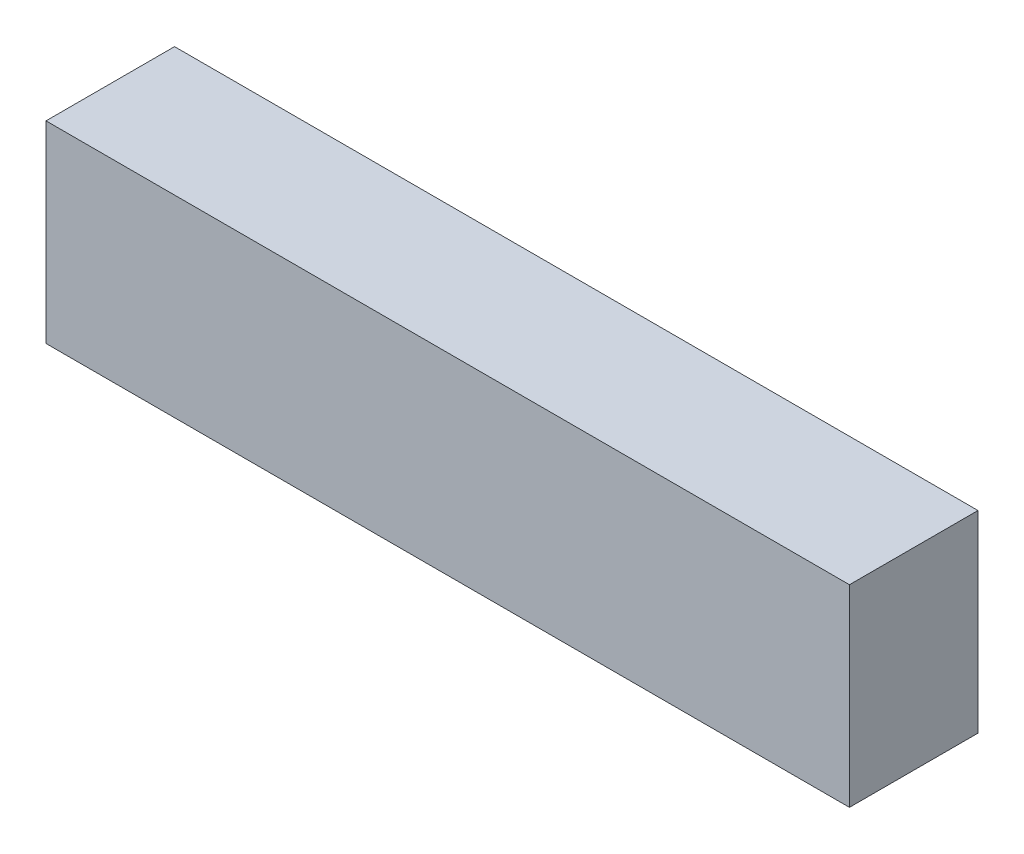
ISO-10303-21;
HEADER;
FILE_DESCRIPTION(('STEP AP214'),'2;1');
FILE_NAME('part.step','',(''),(''),'','','');
FILE_SCHEMA(('AUTOMOTIVE_DESIGN { 1 0 10303 214 1 1 1 1 }'));
ENDSEC;
DATA;
#1=APPLICATION_CONTEXT('core data for automotive mechanical design processes');
#2=APPLICATION_PROTOCOL_DEFINITION('international standard','automotive_design',2000,#1);
#3=PRODUCT_CONTEXT('',#1,'mechanical');
#4=PRODUCT('Part','Part','',(#3));
#5=PRODUCT_RELATED_PRODUCT_CATEGORY('part','',(#4));
#6=PRODUCT_DEFINITION_FORMATION('','',#4);
#7=PRODUCT_DEFINITION_CONTEXT('part definition',#1,'design');
#8=PRODUCT_DEFINITION('design','',#6,#7);
#9=PRODUCT_DEFINITION_SHAPE('','',#8);
#10=(LENGTH_UNIT() NAMED_UNIT(*) SI_UNIT(.MILLI.,.METRE.));
#11=(NAMED_UNIT(*) PLANE_ANGLE_UNIT() SI_UNIT($,.RADIAN.));
#12=(NAMED_UNIT(*) SI_UNIT($,.STERADIAN.) SOLID_ANGLE_UNIT());
#13=UNCERTAINTY_MEASURE_WITH_UNIT(LENGTH_MEASURE(1.E-05),#10,'distance_accuracy_value','');
#14=(GEOMETRIC_REPRESENTATION_CONTEXT(3) GLOBAL_UNCERTAINTY_ASSIGNED_CONTEXT((#13)) GLOBAL_UNIT_ASSIGNED_CONTEXT((#10,
#11,#12)) REPRESENTATION_CONTEXT('',''));
#15=CARTESIAN_POINT('',(0.,0.,0.));
#16=DIRECTION('',(0.,0.,1.));
#17=DIRECTION('',(1.,0.,0.));
#18=AXIS2_PLACEMENT_3D('',#15,#16,#17);
#19=CARTESIAN_POINT('',(25.,-6.,8.));
#20=DIRECTION('',(-1.,0.,0.));
#21=DIRECTION('',(0.,0.,1.));
#22=AXIS2_PLACEMENT_3D('',#19,#20,#21);
#23=PLANE('',#22);
#24=DIRECTION('',(0.,1.,0.));
#25=VECTOR('',#24,1.);
#26=CARTESIAN_POINT('',(25.,-6.,0.));
#27=LINE('',#26,#25);
#28=CARTESIAN_POINT('',(25.,-6.,0.));
#29=VERTEX_POINT('',#28);
#30=CARTESIAN_POINT('',(25.,6.,0.));
#31=VERTEX_POINT('',#30);
#32=EDGE_CURVE('E102',#29,#31,#27,.T.);
#33=ORIENTED_EDGE('',*,*,#32,.T.);
#34=DIRECTION('',(0.,0.,-1.));
#35=VECTOR('',#34,1.);
#36=CARTESIAN_POINT('',(25.,6.,8.));
#37=LINE('',#36,#35);
#38=CARTESIAN_POINT('',(25.,6.,8.));
#39=VERTEX_POINT('',#38);
#40=EDGE_CURVE('E11',#39,#31,#37,.T.);
#41=ORIENTED_EDGE('',*,*,#40,.F.);
#42=DIRECTION('',(0.,1.,0.));
#43=VECTOR('',#42,1.);
#44=CARTESIAN_POINT('',(25.,-6.,8.));
#45=LINE('',#44,#43);
#46=CARTESIAN_POINT('',(25.,-6.,8.));
#47=VERTEX_POINT('',#46);
#48=EDGE_CURVE('E95',#47,#39,#45,.T.);
#49=ORIENTED_EDGE('',*,*,#48,.F.);
#50=DIRECTION('',(0.,0.,-1.));
#51=VECTOR('',#50,1.);
#52=CARTESIAN_POINT('',(25.,-6.,8.));
#53=LINE('',#52,#51);
#54=EDGE_CURVE('E99',#47,#29,#53,.T.);
#55=ORIENTED_EDGE('',*,*,#54,.T.);
#56=EDGE_LOOP('',(#33,#41,#49,#55));
#57=FACE_BOUND('',#56,.T.);
#58=ADVANCED_FACE('F41',(#57),#23,.F.);
#59=CARTESIAN_POINT('',(-25.,6.,8.));
#60=DIRECTION('',(0.,-1.,0.));
#61=DIRECTION('',(0.,0.,-1.));
#62=AXIS2_PLACEMENT_3D('',#59,#60,#61);
#63=PLANE('',#62);
#64=DIRECTION('',(-1.,0.,0.));
#65=VECTOR('',#64,1.);
#66=CARTESIAN_POINT('',(-25.,6.,0.));
#67=LINE('',#66,#65);
#68=CARTESIAN_POINT('',(-25.,6.,0.));
#69=VERTEX_POINT('',#68);
#70=EDGE_CURVE('E96',#31,#69,#67,.T.);
#71=ORIENTED_EDGE('',*,*,#70,.T.);
#72=DIRECTION('',(0.,0.,-1.));
#73=VECTOR('',#72,1.);
#74=CARTESIAN_POINT('',(-25.,6.,8.));
#75=LINE('',#74,#73);
#76=CARTESIAN_POINT('',(-25.,6.,8.));
#77=VERTEX_POINT('',#76);
#78=EDGE_CURVE('E47',#77,#69,#75,.T.);
#79=ORIENTED_EDGE('',*,*,#78,.F.);
#80=DIRECTION('',(-1.,0.,0.));
#81=VECTOR('',#80,1.);
#82=CARTESIAN_POINT('',(-25.,6.,8.));
#83=LINE('',#82,#81);
#84=EDGE_CURVE('E87',#39,#77,#83,.T.);
#85=ORIENTED_EDGE('',*,*,#84,.F.);
#86=ORIENTED_EDGE('',*,*,#40,.T.);
#87=EDGE_LOOP('',(#71,#79,#85,#86));
#88=FACE_BOUND('',#87,.T.);
#89=ADVANCED_FACE('F92',(#88),#63,.F.);
#90=CARTESIAN_POINT('',(-25.,-6.,8.));
#91=DIRECTION('',(1.,0.,0.));
#92=DIRECTION('',(0.,0.,-1.));
#93=AXIS2_PLACEMENT_3D('',#90,#91,#92);
#94=PLANE('',#93);
#95=DIRECTION('',(0.,-1.,0.));
#96=VECTOR('',#95,1.);
#97=CARTESIAN_POINT('',(-25.,-6.,0.));
#98=LINE('',#97,#96);
#99=CARTESIAN_POINT('',(-25.,-6.,0.));
#100=VERTEX_POINT('',#99);
#101=EDGE_CURVE('E74',#69,#100,#98,.T.);
#102=ORIENTED_EDGE('',*,*,#101,.T.);
#103=DIRECTION('',(0.,0.,-1.));
#104=VECTOR('',#103,1.);
#105=CARTESIAN_POINT('',(-25.,-6.,8.));
#106=LINE('',#105,#104);
#107=CARTESIAN_POINT('',(-25.,-6.,8.));
#108=VERTEX_POINT('',#107);
#109=EDGE_CURVE('E100',#108,#100,#106,.T.);
#110=ORIENTED_EDGE('',*,*,#109,.F.);
#111=DIRECTION('',(0.,-1.,0.));
#112=VECTOR('',#111,1.);
#113=CARTESIAN_POINT('',(-25.,-6.,8.));
#114=LINE('',#113,#112);
#115=EDGE_CURVE('E89',#77,#108,#114,.T.);
#116=ORIENTED_EDGE('',*,*,#115,.F.);
#117=ORIENTED_EDGE('',*,*,#78,.T.);
#118=EDGE_LOOP('',(#102,#110,#116,#117));
#119=FACE_BOUND('',#118,.T.);
#120=ADVANCED_FACE('F98',(#119),#94,.F.);
#121=CARTESIAN_POINT('',(-25.,-6.,8.));
#122=DIRECTION('',(0.,1.,0.));
#123=DIRECTION('',(0.,0.,1.));
#124=AXIS2_PLACEMENT_3D('',#121,#122,#123);
#125=PLANE('',#124);
#126=DIRECTION('',(1.,0.,0.));
#127=VECTOR('',#126,1.);
#128=CARTESIAN_POINT('',(-25.,-6.,0.));
#129=LINE('',#128,#127);
#130=EDGE_CURVE('E79',#100,#29,#129,.T.);
#131=ORIENTED_EDGE('',*,*,#130,.T.);
#132=ORIENTED_EDGE('',*,*,#54,.F.);
#133=DIRECTION('',(1.,0.,0.));
#134=VECTOR('',#133,1.);
#135=CARTESIAN_POINT('',(-25.,-6.,8.));
#136=LINE('',#135,#134);
#137=EDGE_CURVE('E60',#108,#47,#136,.T.);
#138=ORIENTED_EDGE('',*,*,#137,.F.);
#139=ORIENTED_EDGE('',*,*,#109,.T.);
#140=EDGE_LOOP('',(#131,#132,#138,#139));
#141=FACE_BOUND('',#140,.T.);
#142=ADVANCED_FACE('F112',(#141),#125,.F.);
#143=CARTESIAN_POINT('',(0.,0.,8.));
#144=DIRECTION('',(0.,0.,-1.));
#145=DIRECTION('',(-1.,0.,0.));
#146=AXIS2_PLACEMENT_3D('',#143,#144,#145);
#147=PLANE('',#146);
#148=ORIENTED_EDGE('',*,*,#48,.T.);
#149=ORIENTED_EDGE('',*,*,#84,.T.);
#150=ORIENTED_EDGE('',*,*,#115,.T.);
#151=ORIENTED_EDGE('',*,*,#137,.T.);
#152=EDGE_LOOP('',(#148,#149,#150,#151));
#153=FACE_BOUND('',#152,.T.);
#154=ADVANCED_FACE('F86',(#153),#147,.F.);
#155=CARTESIAN_POINT('',(0.,0.,0.));
#156=DIRECTION('',(0.,0.,-1.));
#157=DIRECTION('',(-1.,0.,0.));
#158=AXIS2_PLACEMENT_3D('',#155,#156,#157);
#159=PLANE('',#158);
#160=ORIENTED_EDGE('',*,*,#32,.F.);
#161=ORIENTED_EDGE('',*,*,#130,.F.);
#162=ORIENTED_EDGE('',*,*,#101,.F.);
#163=ORIENTED_EDGE('',*,*,#70,.F.);
#164=EDGE_LOOP('',(#160,#161,#162,#163));
#165=FACE_BOUND('',#164,.T.);
#166=ADVANCED_FACE('F111',(#165),#159,.T.);
#167=CLOSED_SHELL('',(#58,#89,#120,#142,#154,#166));
#168=MANIFOLD_SOLID_BREP('B2',#167);
#169=ADVANCED_BREP_SHAPE_REPRESENTATION('',(#18,#168),#14);
#170=SHAPE_DEFINITION_REPRESENTATION(#9,#169);
ENDSEC;
END-ISO-10303-21;
